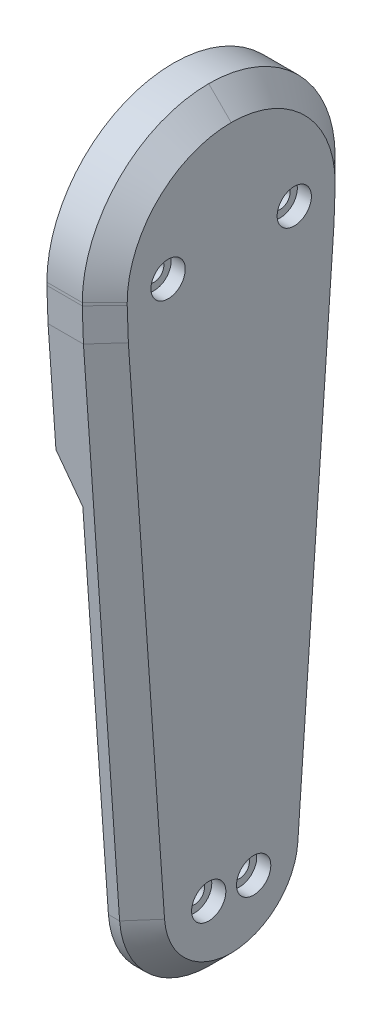
ISO-10303-21;
HEADER;
FILE_DESCRIPTION(('STEP AP214'),'2;1');
FILE_NAME('part.step','',(''),(''),'','','');
FILE_SCHEMA(('AUTOMOTIVE_DESIGN { 1 0 10303 214 1 1 1 1 }'));
ENDSEC;
DATA;
#1=APPLICATION_CONTEXT('core data for automotive mechanical design processes');
#2=APPLICATION_PROTOCOL_DEFINITION('international standard','automotive_design',2000,#1);
#3=PRODUCT_CONTEXT('',#1,'mechanical');
#4=PRODUCT('Part','Part','',(#3));
#5=PRODUCT_RELATED_PRODUCT_CATEGORY('part','',(#4));
#6=PRODUCT_DEFINITION_FORMATION('','',#4);
#7=PRODUCT_DEFINITION_CONTEXT('part definition',#1,'design');
#8=PRODUCT_DEFINITION('design','',#6,#7);
#9=PRODUCT_DEFINITION_SHAPE('','',#8);
#10=(LENGTH_UNIT() NAMED_UNIT(*) SI_UNIT(.MILLI.,.METRE.));
#11=(NAMED_UNIT(*) PLANE_ANGLE_UNIT() SI_UNIT($,.RADIAN.));
#12=(NAMED_UNIT(*) SI_UNIT($,.STERADIAN.) SOLID_ANGLE_UNIT());
#13=UNCERTAINTY_MEASURE_WITH_UNIT(LENGTH_MEASURE(1.E-05),#10,'distance_accuracy_value','');
#14=(GEOMETRIC_REPRESENTATION_CONTEXT(3) GLOBAL_UNCERTAINTY_ASSIGNED_CONTEXT((#13)) GLOBAL_UNIT_ASSIGNED_CONTEXT((#10,
#11,#12)) REPRESENTATION_CONTEXT('',''));
#15=CARTESIAN_POINT('',(0.,0.,0.));
#16=DIRECTION('',(0.,0.,1.));
#17=DIRECTION('',(1.,0.,0.));
#18=AXIS2_PLACEMENT_3D('',#15,#16,#17);
#19=CARTESIAN_POINT('',(28.3,-99.5,4.));
#20=DIRECTION('',(-1.,0.,0.));
#21=DIRECTION('',(0.,0.,1.));
#22=AXIS2_PLACEMENT_3D('',#19,#20,#21);
#23=CYLINDRICAL_SURFACE('',#22,1.75);
#24=CARTESIAN_POINT('',(22.3,-99.5,4.));
#25=DIRECTION('',(-1.,0.,0.));
#26=DIRECTION('',(0.,0.,1.));
#27=AXIS2_PLACEMENT_3D('',#24,#25,#26);
#28=CIRCLE('',#27,1.75);
#29=CARTESIAN_POINT('',(22.3,-99.5,5.75));
#30=VERTEX_POINT('',#29);
#31=EDGE_CURVE('E280',#30,#30,#28,.T.);
#32=ORIENTED_EDGE('',*,*,#31,.T.);
#33=EDGE_LOOP('',(#32));
#34=FACE_BOUND('',#33,.T.);
#35=CARTESIAN_POINT('',(25.8,-99.5,4.));
#36=DIRECTION('',(1.,0.,0.));
#37=DIRECTION('',(0.,0.,-1.));
#38=AXIS2_PLACEMENT_3D('',#35,#36,#37);
#39=CIRCLE('',#38,1.75);
#40=CARTESIAN_POINT('',(25.8,-99.5,2.25));
#41=VERTEX_POINT('',#40);
#42=EDGE_CURVE('E113',#41,#41,#39,.F.);
#43=ORIENTED_EDGE('',*,*,#42,.F.);
#44=EDGE_LOOP('',(#43));
#45=FACE_BOUND('',#44,.T.);
#46=ADVANCED_FACE('F108',(#34,#45),#23,.F.);
#47=CARTESIAN_POINT('',(28.3,-99.5,-4.));
#48=DIRECTION('',(-1.,0.,0.));
#49=DIRECTION('',(0.,0.,1.));
#50=AXIS2_PLACEMENT_3D('',#47,#48,#49);
#51=CYLINDRICAL_SURFACE('',#50,1.75);
#52=CARTESIAN_POINT('',(22.3,-99.5,-4.));
#53=DIRECTION('',(-1.,0.,0.));
#54=DIRECTION('',(0.,0.,1.));
#55=AXIS2_PLACEMENT_3D('',#52,#53,#54);
#56=CIRCLE('',#55,1.75);
#57=CARTESIAN_POINT('',(22.3,-99.5,-2.25));
#58=VERTEX_POINT('',#57);
#59=EDGE_CURVE('E281',#58,#58,#56,.T.);
#60=ORIENTED_EDGE('',*,*,#59,.T.);
#61=EDGE_LOOP('',(#60));
#62=FACE_BOUND('',#61,.T.);
#63=CARTESIAN_POINT('',(25.8,-99.5,-4.));
#64=DIRECTION('',(1.,0.,0.));
#65=DIRECTION('',(0.,0.,-1.));
#66=AXIS2_PLACEMENT_3D('',#63,#64,#65);
#67=CIRCLE('',#66,1.75);
#68=CARTESIAN_POINT('',(25.8,-99.5,-5.75));
#69=VERTEX_POINT('',#68);
#70=EDGE_CURVE('E600',#69,#69,#67,.F.);
#71=ORIENTED_EDGE('',*,*,#70,.F.);
#72=EDGE_LOOP('',(#71));
#73=FACE_BOUND('',#72,.T.);
#74=ADVANCED_FACE('F471',(#62,#73),#51,.F.);
#75=CARTESIAN_POINT('',(28.3,0.,11.225));
#76=DIRECTION('',(-1.,0.,0.));
#77=DIRECTION('',(0.,0.,1.));
#78=AXIS2_PLACEMENT_3D('',#75,#76,#77);
#79=CYLINDRICAL_SURFACE('',#78,1.75);
#80=CARTESIAN_POINT('',(18.,0.,11.225));
#81=DIRECTION('',(-1.,0.,0.));
#82=DIRECTION('',(0.,0.,1.));
#83=AXIS2_PLACEMENT_3D('',#80,#81,#82);
#84=CIRCLE('',#83,1.75);
#85=CARTESIAN_POINT('',(18.,0.,12.975));
#86=VERTEX_POINT('',#85);
#87=EDGE_CURVE('E242',#86,#86,#84,.T.);
#88=ORIENTED_EDGE('',*,*,#87,.T.);
#89=EDGE_LOOP('',(#88));
#90=FACE_BOUND('',#89,.T.);
#91=CARTESIAN_POINT('',(25.8,0.,11.225));
#92=DIRECTION('',(1.,0.,0.));
#93=DIRECTION('',(0.,0.,-1.));
#94=AXIS2_PLACEMENT_3D('',#91,#92,#93);
#95=CIRCLE('',#94,1.75);
#96=CARTESIAN_POINT('',(25.8,0.,9.475));
#97=VERTEX_POINT('',#96);
#98=EDGE_CURVE('E596',#97,#97,#95,.F.);
#99=ORIENTED_EDGE('',*,*,#98,.F.);
#100=EDGE_LOOP('',(#99));
#101=FACE_BOUND('',#100,.T.);
#102=ADVANCED_FACE('F478',(#90,#101),#79,.F.);
#103=CARTESIAN_POINT('',(28.3,0.,-11.225));
#104=DIRECTION('',(-1.,0.,0.));
#105=DIRECTION('',(0.,0.,1.));
#106=AXIS2_PLACEMENT_3D('',#103,#104,#105);
#107=CYLINDRICAL_SURFACE('',#106,1.75);
#108=CARTESIAN_POINT('',(18.,0.,-11.225));
#109=DIRECTION('',(-1.,0.,0.));
#110=DIRECTION('',(0.,0.,1.));
#111=AXIS2_PLACEMENT_3D('',#108,#109,#110);
#112=CIRCLE('',#111,1.75);
#113=CARTESIAN_POINT('',(18.,0.,-9.475));
#114=VERTEX_POINT('',#113);
#115=EDGE_CURVE('E607',#114,#114,#112,.T.);
#116=ORIENTED_EDGE('',*,*,#115,.T.);
#117=EDGE_LOOP('',(#116));
#118=FACE_BOUND('',#117,.T.);
#119=CARTESIAN_POINT('',(25.8,0.,-11.225));
#120=DIRECTION('',(1.,0.,0.));
#121=DIRECTION('',(0.,0.,-1.));
#122=AXIS2_PLACEMENT_3D('',#119,#120,#121);
#123=CIRCLE('',#122,1.75);
#124=CARTESIAN_POINT('',(25.8,0.,-12.975));
#125=VERTEX_POINT('',#124);
#126=EDGE_CURVE('E592',#125,#125,#123,.F.);
#127=ORIENTED_EDGE('',*,*,#126,.F.);
#128=EDGE_LOOP('',(#127));
#129=FACE_BOUND('',#128,.T.);
#130=ADVANCED_FACE('F501',(#118,#129),#107,.F.);
#131=CARTESIAN_POINT('',(28.3,35.,-22.5));
#132=DIRECTION('',(0.,0.,1.));
#133=DIRECTION('',(0.,-1.,0.));
#134=AXIS2_PLACEMENT_3D('',#131,#132,#133);
#135=PLANE('',#134);
#136=DIRECTION('',(-1.,0.,0.));
#137=VECTOR('',#136,1.);
#138=CARTESIAN_POINT('',(28.3,0.,-22.5));
#139=LINE('',#138,#137);
#140=CARTESIAN_POINT('',(18.,0.,-22.5));
#141=VERTEX_POINT('',#140);
#142=CARTESIAN_POINT('',(24.3,0.,-22.5));
#143=VERTEX_POINT('',#142);
#144=EDGE_CURVE('E294',#141,#143,#139,.F.);
#145=ORIENTED_EDGE('',*,*,#144,.T.);
#146=DIRECTION('',(0.,-1.,0.));
#147=VECTOR('',#146,1.);
#148=CARTESIAN_POINT('',(24.3,-0.499999999994338,-22.5));
#149=LINE('',#148,#147);
#150=CARTESIAN_POINT('',(24.3,-0.499999999994337,-22.5));
#151=VERTEX_POINT('',#150);
#152=EDGE_CURVE('E368',#143,#151,#149,.T.);
#153=ORIENTED_EDGE('',*,*,#152,.T.);
#154=DIRECTION('',(-1.,0.,0.));
#155=VECTOR('',#154,1.);
#156=CARTESIAN_POINT('',(20.,-0.499999999994337,-22.5));
#157=LINE('',#156,#155);
#158=CARTESIAN_POINT('',(18.,-0.499999999994338,-22.5));
#159=VERTEX_POINT('',#158);
#160=EDGE_CURVE('E253',#151,#159,#157,.T.);
#161=ORIENTED_EDGE('',*,*,#160,.T.);
#162=DIRECTION('',(0.,-1.,0.));
#163=VECTOR('',#162,1.);
#164=CARTESIAN_POINT('',(18.,0.,-22.5));
#165=LINE('',#164,#163);
#166=EDGE_CURVE('E269',#141,#159,#165,.T.);
#167=ORIENTED_EDGE('',*,*,#166,.F.);
#168=EDGE_LOOP('',(#145,#153,#161,#167));
#169=FACE_BOUND('',#168,.T.);
#170=ADVANCED_FACE('F497',(#169),#135,.F.);
#171=CARTESIAN_POINT('',(28.3,35.,22.5));
#172=DIRECTION('',(0.,0.,-1.));
#173=DIRECTION('',(0.,1.,0.));
#174=AXIS2_PLACEMENT_3D('',#171,#172,#173);
#175=PLANE('',#174);
#176=DIRECTION('',(1.,0.,0.));
#177=VECTOR('',#176,1.);
#178=CARTESIAN_POINT('',(28.3,-0.499999999994215,22.5));
#179=LINE('',#178,#177);
#180=CARTESIAN_POINT('',(18.,-0.499999999994213,22.5));
#181=VERTEX_POINT('',#180);
#182=CARTESIAN_POINT('',(24.3,-0.499999999994215,22.5));
#183=VERTEX_POINT('',#182);
#184=EDGE_CURVE('E254',#181,#183,#179,.T.);
#185=ORIENTED_EDGE('',*,*,#184,.T.);
#186=DIRECTION('',(0.,1.,0.));
#187=VECTOR('',#186,1.);
#188=CARTESIAN_POINT('',(24.3,0.,22.5));
#189=LINE('',#188,#187);
#190=CARTESIAN_POINT('',(24.3,0.,22.5));
#191=VERTEX_POINT('',#190);
#192=EDGE_CURVE('E377',#183,#191,#189,.T.);
#193=ORIENTED_EDGE('',*,*,#192,.T.);
#194=DIRECTION('',(1.,0.,0.));
#195=VECTOR('',#194,1.);
#196=CARTESIAN_POINT('',(20.,0.,22.5));
#197=LINE('',#196,#195);
#198=CARTESIAN_POINT('',(18.,0.,22.5));
#199=VERTEX_POINT('',#198);
#200=EDGE_CURVE('E298',#191,#199,#197,.F.);
#201=ORIENTED_EDGE('',*,*,#200,.T.);
#202=DIRECTION('',(0.,1.,0.));
#203=VECTOR('',#202,1.);
#204=CARTESIAN_POINT('',(18.,-0.499999999994213,22.5));
#205=LINE('',#204,#203);
#206=EDGE_CURVE('E259',#181,#199,#205,.T.);
#207=ORIENTED_EDGE('',*,*,#206,.F.);
#208=EDGE_LOOP('',(#185,#193,#201,#207));
#209=FACE_BOUND('',#208,.T.);
#210=ADVANCED_FACE('F493',(#209),#175,.F.);
#211=CARTESIAN_POINT('',(28.3,0.,0.));
#212=DIRECTION('',(1.,0.,0.));
#213=DIRECTION('',(0.,0.,-1.));
#214=AXIS2_PLACEMENT_3D('',#211,#212,#213);
#215=PLANE('',#214);
#216=CARTESIAN_POINT('',(28.3,0.,11.225));
#217=DIRECTION('',(1.,0.,0.));
#218=DIRECTION('',(0.,0.,-1.));
#219=AXIS2_PLACEMENT_3D('',#216,#217,#218);
#220=CIRCLE('',#219,3.05);
#221=CARTESIAN_POINT('',(28.3,0.,8.175));
#222=VERTEX_POINT('',#221);
#223=EDGE_CURVE('E635',#222,#222,#220,.T.);
#224=ORIENTED_EDGE('',*,*,#223,.F.);
#225=EDGE_LOOP('',(#224));
#226=FACE_BOUND('',#225,.T.);
#227=CARTESIAN_POINT('',(28.3,-99.5,-4.));
#228=DIRECTION('',(1.,0.,0.));
#229=DIRECTION('',(0.,0.,-1.));
#230=AXIS2_PLACEMENT_3D('',#227,#228,#229);
#231=CIRCLE('',#230,3.05);
#232=CARTESIAN_POINT('',(28.3,-99.5,-7.05));
#233=VERTEX_POINT('',#232);
#234=EDGE_CURVE('E623',#233,#233,#231,.T.);
#235=ORIENTED_EDGE('',*,*,#234,.F.);
#236=EDGE_LOOP('',(#235));
#237=FACE_BOUND('',#236,.T.);
#238=CARTESIAN_POINT('',(28.3,-99.5,4.));
#239=DIRECTION('',(1.,0.,0.));
#240=DIRECTION('',(0.,0.,-1.));
#241=AXIS2_PLACEMENT_3D('',#238,#239,#240);
#242=CIRCLE('',#241,3.05);
#243=CARTESIAN_POINT('',(28.3,-99.5,0.950000000000003));
#244=VERTEX_POINT('',#243);
#245=EDGE_CURVE('E622',#244,#244,#242,.T.);
#246=ORIENTED_EDGE('',*,*,#245,.F.);
#247=EDGE_LOOP('',(#246));
#248=FACE_BOUND('',#247,.T.);
#249=CARTESIAN_POINT('',(28.3,0.,-11.225));
#250=DIRECTION('',(1.,0.,0.));
#251=DIRECTION('',(0.,0.,-1.));
#252=AXIS2_PLACEMENT_3D('',#249,#250,#251);
#253=CIRCLE('',#252,3.05);
#254=CARTESIAN_POINT('',(28.3,0.,-14.275));
#255=VERTEX_POINT('',#254);
#256=EDGE_CURVE('E631',#255,#255,#253,.T.);
#257=ORIENTED_EDGE('',*,*,#256,.F.);
#258=EDGE_LOOP('',(#257));
#259=FACE_BOUND('',#258,.T.);
#260=DIRECTION('',(0.,0.997564050259825,-0.0697564737441219));
#261=VECTOR('',#260,1.);
#262=CARTESIAN_POINT('',(28.3,-1.3037023705264,-18.6438124989831));
#263=LINE('',#262,#261);
#264=CARTESIAN_POINT('',(28.3,-98.3370776849295,-11.8585779111291));
#265=VERTEX_POINT('',#264);
#266=CARTESIAN_POINT('',(28.3,-6.283316436867,-18.2956039626149));
#267=VERTEX_POINT('',#266);
#268=EDGE_CURVE('E330',#265,#267,#263,.T.);
#269=ORIENTED_EDGE('',*,*,#268,.T.);
#270=DIRECTION('',(0.,0.999390827019096,-0.0348994967024992));
#271=VECTOR('',#270,1.);
#272=CARTESIAN_POINT('',(28.3,-0.645771330246411,-18.4924713757825));
#273=LINE('',#272,#271);
#274=CARTESIAN_POINT('',(28.3,-0.430179740281577,-18.5));
#275=VERTEX_POINT('',#274);
#276=EDGE_CURVE('E360',#267,#275,#273,.T.);
#277=ORIENTED_EDGE('',*,*,#276,.T.);
#278=DIRECTION('',(0.,1.,0.));
#279=VECTOR('',#278,1.);
#280=CARTESIAN_POINT('',(28.3,0.,-18.5));
#281=LINE('',#280,#279);
#282=CARTESIAN_POINT('',(28.3,0.,-18.5));
#283=VERTEX_POINT('',#282);
#284=EDGE_CURVE('E357',#275,#283,#281,.T.);
#285=ORIENTED_EDGE('',*,*,#284,.T.);
#286=CARTESIAN_POINT('',(28.3,0.,0.));
#287=DIRECTION('',(1.,0.,0.));
#288=DIRECTION('',(0.,0.,-1.));
#289=AXIS2_PLACEMENT_3D('',#286,#287,#288);
#290=CIRCLE('',#289,18.5);
#291=CARTESIAN_POINT('',(28.3,18.5,0.));
#292=VERTEX_POINT('',#291);
#293=EDGE_CURVE('E354',#283,#292,#290,.T.);
#294=ORIENTED_EDGE('',*,*,#293,.T.);
#295=CARTESIAN_POINT('',(28.3,0.,0.));
#296=DIRECTION('',(1.,0.,0.));
#297=DIRECTION('',(0.,0.,-1.));
#298=AXIS2_PLACEMENT_3D('',#295,#296,#297);
#299=CIRCLE('',#298,18.5);
#300=CARTESIAN_POINT('',(28.3,0.,18.5));
#301=VERTEX_POINT('',#300);
#302=EDGE_CURVE('E351',#292,#301,#299,.T.);
#303=ORIENTED_EDGE('',*,*,#302,.T.);
#304=DIRECTION('',(0.,-1.,0.));
#305=VECTOR('',#304,1.);
#306=CARTESIAN_POINT('',(28.3,-0.499999999994213,18.5));
#307=LINE('',#306,#305);
#308=CARTESIAN_POINT('',(28.3,-0.430179740281471,18.5));
#309=VERTEX_POINT('',#308);
#310=EDGE_CURVE('E348',#301,#309,#307,.T.);
#311=ORIENTED_EDGE('',*,*,#310,.T.);
#312=DIRECTION('',(0.,-0.999390827019096,-0.0348994967024948));
#313=VECTOR('',#312,1.);
#314=CARTESIAN_POINT('',(28.3,-0.645771330246329,18.4924713757825));
#315=LINE('',#314,#313);
#316=CARTESIAN_POINT('',(28.3,-6.28331643686655,18.2956039626149));
#317=VERTEX_POINT('',#316);
#318=EDGE_CURVE('E345',#309,#317,#315,.T.);
#319=ORIENTED_EDGE('',*,*,#318,.T.);
#320=DIRECTION('',(0.,-0.997564050259825,-0.069756473744122));
#321=VECTOR('',#320,1.);
#322=CARTESIAN_POINT('',(28.3,-1.3037023705264,18.6438124989831));
#323=LINE('',#322,#321);
#324=CARTESIAN_POINT('',(28.3,-98.3370776849295,11.8585779111291));
#325=VERTEX_POINT('',#324);
#326=EDGE_CURVE('E342',#317,#325,#323,.T.);
#327=ORIENTED_EDGE('',*,*,#326,.T.);
#328=CARTESIAN_POINT('',(28.3,-97.5,-0.112190691988799));
#329=DIRECTION('',(1.,0.,0.));
#330=DIRECTION('',(0.,0.,-1.));
#331=AXIS2_PLACEMENT_3D('',#328,#329,#330);
#332=CIRCLE('',#331,12.);
#333=CARTESIAN_POINT('',(28.3,-109.499475540566,0.));
#334=VERTEX_POINT('',#333);
#335=EDGE_CURVE('E339',#325,#334,#332,.T.);
#336=ORIENTED_EDGE('',*,*,#335,.T.);
#337=CARTESIAN_POINT('',(28.3,-97.5,0.112190691988787));
#338=DIRECTION('',(1.,0.,0.));
#339=DIRECTION('',(0.,0.,-1.));
#340=AXIS2_PLACEMENT_3D('',#337,#338,#339);
#341=CIRCLE('',#340,12.);
#342=EDGE_CURVE('E336',#334,#265,#341,.T.);
#343=ORIENTED_EDGE('',*,*,#342,.T.);
#344=EDGE_LOOP('',(#269,#277,#285,#294,#303,#311,#319,#327,#336,#343));
#345=FACE_BOUND('',#344,.T.);
#346=ADVANCED_FACE('F490',(#226,#237,#248,#259,#345),#215,.T.);
#347=CARTESIAN_POINT('',(0.,0.,0.));
#348=DIRECTION('',(-1.,0.,0.));
#349=DIRECTION('',(0.,0.,1.));
#350=AXIS2_PLACEMENT_3D('',#347,#348,#349);
#351=CYLINDRICAL_SURFACE('',#350,22.5);
#352=ORIENTED_EDGE('',*,*,#200,.F.);
#353=CARTESIAN_POINT('',(24.3,0.,0.));
#354=DIRECTION('',(1.,0.,0.));
#355=DIRECTION('',(0.,0.,-1.));
#356=AXIS2_PLACEMENT_3D('',#353,#354,#355);
#357=CIRCLE('',#356,22.5);
#358=CARTESIAN_POINT('',(24.3,22.5,0.));
#359=VERTEX_POINT('',#358);
#360=EDGE_CURVE('E374',#191,#359,#357,.F.);
#361=ORIENTED_EDGE('',*,*,#360,.T.);
#362=DIRECTION('',(1.,0.,0.));
#363=VECTOR('',#362,1.);
#364=CARTESIAN_POINT('',(28.3,22.5,0.));
#365=LINE('',#364,#363);
#366=CARTESIAN_POINT('',(20.,22.5,0.));
#367=VERTEX_POINT('',#366);
#368=EDGE_CURVE('E292',#367,#359,#365,.T.);
#369=ORIENTED_EDGE('',*,*,#368,.F.);
#370=ORIENTED_EDGE('',*,*,#368,.T.);
#371=CARTESIAN_POINT('',(24.3,0.,0.));
#372=DIRECTION('',(1.,0.,0.));
#373=DIRECTION('',(0.,0.,-1.));
#374=AXIS2_PLACEMENT_3D('',#371,#372,#373);
#375=CIRCLE('',#374,22.5);
#376=EDGE_CURVE('E371',#359,#143,#375,.F.);
#377=ORIENTED_EDGE('',*,*,#376,.T.);
#378=ORIENTED_EDGE('',*,*,#144,.F.);
#379=CARTESIAN_POINT('',(18.,0.,0.));
#380=DIRECTION('',(-1.,0.,0.));
#381=DIRECTION('',(0.,0.,1.));
#382=AXIS2_PLACEMENT_3D('',#379,#380,#381);
#383=CIRCLE('',#382,22.5);
#384=EDGE_CURVE('E262',#199,#141,#383,.T.);
#385=ORIENTED_EDGE('',*,*,#384,.F.);
#386=EDGE_LOOP('',(#352,#361,#369,#370,#377,#378,#385));
#387=FACE_BOUND('',#386,.T.);
#388=ADVANCED_FACE('F488',(#387),#351,.T.);
#389=CARTESIAN_POINT('',(22.3,0.,0.));
#390=DIRECTION('',(1.,0.,0.));
#391=DIRECTION('',(0.,0.,-1.));
#392=AXIS2_PLACEMENT_3D('',#389,#390,#391);
#393=PLANE('',#392);
#394=ORIENTED_EDGE('',*,*,#59,.F.);
#395=EDGE_LOOP('',(#394));
#396=FACE_BOUND('',#395,.T.);
#397=ORIENTED_EDGE('',*,*,#31,.F.);
#398=EDGE_LOOP('',(#397));
#399=FACE_BOUND('',#398,.T.);
#400=DIRECTION('',(0.,-0.997564050259825,0.0697564737441219));
#401=VECTOR('',#400,1.);
#402=CARTESIAN_POINT('',(22.3,-113.5,-14.8080506862139));
#403=LINE('',#402,#401);
#404=CARTESIAN_POINT('',(22.3,-33.5,-20.4021956416944));
#405=VERTEX_POINT('',#404);
#406=CARTESIAN_POINT('',(22.3,-98.616103579906,-15.8488341121684));
#407=VERTEX_POINT('',#406);
#408=EDGE_CURVE('E305',#405,#407,#403,.T.);
#409=ORIENTED_EDGE('',*,*,#408,.T.);
#410=CARTESIAN_POINT('',(22.3,-97.5,0.112190691988787));
#411=DIRECTION('',(1.,0.,0.));
#412=DIRECTION('',(0.,0.,-1.));
#413=AXIS2_PLACEMENT_3D('',#410,#411,#412);
#414=CIRCLE('',#413,16.);
#415=CARTESIAN_POINT('',(22.3,-113.499606659185,0.));
#416=VERTEX_POINT('',#415);
#417=EDGE_CURVE('E323',#407,#416,#414,.F.);
#418=ORIENTED_EDGE('',*,*,#417,.T.);
#419=CARTESIAN_POINT('',(22.3,-97.5,-0.112190691988799));
#420=DIRECTION('',(1.,0.,0.));
#421=DIRECTION('',(0.,0.,-1.));
#422=AXIS2_PLACEMENT_3D('',#419,#420,#421);
#423=CIRCLE('',#422,16.);
#424=CARTESIAN_POINT('',(22.3,-98.616103579906,15.8488341121684));
#425=VERTEX_POINT('',#424);
#426=EDGE_CURVE('E320',#416,#425,#423,.F.);
#427=ORIENTED_EDGE('',*,*,#426,.T.);
#428=DIRECTION('',(0.,0.997564050259825,0.069756473744122));
#429=VECTOR('',#428,1.);
#430=CARTESIAN_POINT('',(22.3,-113.5,14.8080506862138));
#431=LINE('',#430,#429);
#432=CARTESIAN_POINT('',(22.3,-33.5,20.4021956416944));
#433=VERTEX_POINT('',#432);
#434=EDGE_CURVE('E301',#425,#433,#431,.T.);
#435=ORIENTED_EDGE('',*,*,#434,.T.);
#436=DIRECTION('',(0.,0.,-1.));
#437=VECTOR('',#436,1.);
#438=CARTESIAN_POINT('',(22.3,-33.5,-22.5));
#439=LINE('',#438,#437);
#440=EDGE_CURVE('E289',#433,#405,#439,.T.);
#441=ORIENTED_EDGE('',*,*,#440,.T.);
#442=EDGE_LOOP('',(#409,#418,#427,#435,#441));
#443=FACE_BOUND('',#442,.T.);
#444=ADVANCED_FACE('F484',(#396,#399,#443),#393,.F.);
#445=CARTESIAN_POINT('',(0.,-113.5,-14.8080506862139));
#446=DIRECTION('',(0.,-0.0697564737441219,-0.997564050259825));
#447=DIRECTION('',(-1.,0.,0.));
#448=AXIS2_PLACEMENT_3D('',#445,#446,#447);
#449=PLANE('',#448);
#450=ORIENTED_EDGE('',*,*,#408,.F.);
#451=DIRECTION('',(-0.528989945837286,0.846560875838962,-0.0591973031635217));
#452=VECTOR('',#451,1.);
#453=CARTESIAN_POINT('',(52.0607376667368,-81.1271360978114,-17.0717818523749));
#454=LINE('',#453,#452);
#455=CARTESIAN_POINT('',(18.,-26.6185615251235,-20.8833926958279));
#456=VERTEX_POINT('',#455);
#457=EDGE_CURVE('E12',#405,#456,#454,.T.);
#458=ORIENTED_EDGE('',*,*,#457,.T.);
#459=DIRECTION('',(0.,-0.997564050259825,0.0697564737441218));
#460=VECTOR('',#459,1.);
#461=CARTESIAN_POINT('',(18.,-6.49269215077417,-22.2907305787676));
#462=LINE('',#461,#460);
#463=CARTESIAN_POINT('',(18.,-6.49269215077417,-22.2907305787676));
#464=VERTEX_POINT('',#463);
#465=EDGE_CURVE('E277',#464,#456,#462,.T.);
#466=ORIENTED_EDGE('',*,*,#465,.F.);
#467=DIRECTION('',(1.,0.,0.));
#468=VECTOR('',#467,1.);
#469=CARTESIAN_POINT('',(28.3,-6.49269215077418,-22.2907305787676));
#470=LINE('',#469,#468);
#471=CARTESIAN_POINT('',(24.3,-6.49269215077418,-22.2907305787676));
#472=VERTEX_POINT('',#471);
#473=EDGE_CURVE('E313',#464,#472,#470,.T.);
#474=ORIENTED_EDGE('',*,*,#473,.T.);
#475=DIRECTION('',(0.,-0.997564050259825,0.0697564737441219));
#476=VECTOR('',#475,1.);
#477=CARTESIAN_POINT('',(24.3,-113.5,-14.8080506862139));
#478=LINE('',#477,#476);
#479=CARTESIAN_POINT('',(24.3,-98.616103579906,-15.8488341121684));
#480=VERTEX_POINT('',#479);
#481=EDGE_CURVE('E391',#472,#480,#478,.T.);
#482=ORIENTED_EDGE('',*,*,#481,.T.);
#483=DIRECTION('',(1.,0.,0.));
#484=VECTOR('',#483,1.);
#485=CARTESIAN_POINT('',(0.,-98.616103579906,-15.8488341121684));
#486=LINE('',#485,#484);
#487=EDGE_CURVE('E317',#480,#407,#486,.F.);
#488=ORIENTED_EDGE('',*,*,#487,.T.);
#489=EDGE_LOOP('',(#450,#458,#466,#474,#482,#488));
#490=FACE_BOUND('',#489,.T.);
#491=ADVANCED_FACE('F487',(#490),#449,.T.);
#492=CARTESIAN_POINT('',(0.,-113.5,14.8080506862138));
#493=DIRECTION('',(0.,-0.069756473744122,0.997564050259825));
#494=DIRECTION('',(1.,0.,0.));
#495=AXIS2_PLACEMENT_3D('',#492,#493,#494);
#496=PLANE('',#495);
#497=DIRECTION('',(0.,0.997564050259824,0.0697564737441226));
#498=VECTOR('',#497,1.);
#499=CARTESIAN_POINT('',(18.,-33.5,20.4021956416944));
#500=LINE('',#499,#498);
#501=CARTESIAN_POINT('',(18.,-26.6185615251235,20.8833926958279));
#502=VERTEX_POINT('',#501);
#503=CARTESIAN_POINT('',(18.,-6.49269215077375,22.2907305787677));
#504=VERTEX_POINT('',#503);
#505=EDGE_CURVE('E231',#502,#504,#500,.T.);
#506=ORIENTED_EDGE('',*,*,#505,.F.);
#507=DIRECTION('',(0.528989945837286,-0.846560875838962,-0.0591973031635218));
#508=VECTOR('',#507,1.);
#509=CARTESIAN_POINT('',(52.0607376667368,-81.1271360978114,17.0717818523749));
#510=LINE('',#509,#508);
#511=EDGE_CURVE('E119',#502,#433,#510,.T.);
#512=ORIENTED_EDGE('',*,*,#511,.T.);
#513=ORIENTED_EDGE('',*,*,#434,.F.);
#514=DIRECTION('',(-1.,0.,0.));
#515=VECTOR('',#514,1.);
#516=CARTESIAN_POINT('',(0.,-98.616103579906,15.8488341121684));
#517=LINE('',#516,#515);
#518=CARTESIAN_POINT('',(24.3,-98.616103579906,15.8488341121684));
#519=VERTEX_POINT('',#518);
#520=EDGE_CURVE('E327',#425,#519,#517,.F.);
#521=ORIENTED_EDGE('',*,*,#520,.T.);
#522=DIRECTION('',(0.,0.997564050259825,0.069756473744122));
#523=VECTOR('',#522,1.);
#524=CARTESIAN_POINT('',(24.3,-113.5,14.8080506862138));
#525=LINE('',#524,#523);
#526=CARTESIAN_POINT('',(24.3,-6.49269215077377,22.2907305787677));
#527=VERTEX_POINT('',#526);
#528=EDGE_CURVE('E249',#519,#527,#525,.T.);
#529=ORIENTED_EDGE('',*,*,#528,.T.);
#530=DIRECTION('',(-1.,0.,0.));
#531=VECTOR('',#530,1.);
#532=CARTESIAN_POINT('',(20.,-6.49269215077377,22.2907305787677));
#533=LINE('',#532,#531);
#534=EDGE_CURVE('E245',#527,#504,#533,.T.);
#535=ORIENTED_EDGE('',*,*,#534,.T.);
#536=EDGE_LOOP('',(#506,#512,#513,#521,#529,#535));
#537=FACE_BOUND('',#536,.T.);
#538=ADVANCED_FACE('F246',(#537),#496,.T.);
#539=CARTESIAN_POINT('',(28.3,-0.499999999994213,22.5));
#540=DIRECTION('',(0.,-0.0348994967024948,0.999390827019096));
#541=DIRECTION('',(-1.,0.,0.));
#542=AXIS2_PLACEMENT_3D('',#539,#540,#541);
#543=PLANE('',#542);
#544=ORIENTED_EDGE('',*,*,#534,.F.);
#545=DIRECTION('',(0.,0.999390827019096,0.0348994967024948));
#546=VECTOR('',#545,1.);
#547=CARTESIAN_POINT('',(24.3,-0.499999999994213,22.5));
#548=LINE('',#547,#546);
#549=EDGE_CURVE('E380',#527,#183,#548,.T.);
#550=ORIENTED_EDGE('',*,*,#549,.T.);
#551=ORIENTED_EDGE('',*,*,#184,.F.);
#552=DIRECTION('',(0.,0.999390827019096,0.034899496702495));
#553=VECTOR('',#552,1.);
#554=CARTESIAN_POINT('',(18.,-6.49269215077375,22.2907305787677));
#555=LINE('',#554,#553);
#556=EDGE_CURVE('E237',#504,#181,#555,.T.);
#557=ORIENTED_EDGE('',*,*,#556,.F.);
#558=EDGE_LOOP('',(#544,#550,#551,#557));
#559=FACE_BOUND('',#558,.T.);
#560=ADVANCED_FACE('F256',(#559),#543,.T.);
#561=CARTESIAN_POINT('',(28.3,-0.499999999994338,-22.5));
#562=DIRECTION('',(0.,-0.0348994967024992,-0.999390827019096));
#563=DIRECTION('',(1.,0.,0.));
#564=AXIS2_PLACEMENT_3D('',#561,#562,#563);
#565=PLANE('',#564);
#566=ORIENTED_EDGE('',*,*,#160,.F.);
#567=DIRECTION('',(0.,-0.999390827019096,0.0348994967024992));
#568=VECTOR('',#567,1.);
#569=CARTESIAN_POINT('',(24.3,-0.499999999994338,-22.5));
#570=LINE('',#569,#568);
#571=EDGE_CURVE('E364',#151,#472,#570,.T.);
#572=ORIENTED_EDGE('',*,*,#571,.T.);
#573=ORIENTED_EDGE('',*,*,#473,.F.);
#574=DIRECTION('',(0.,-0.999390827019096,0.0348994967024991));
#575=VECTOR('',#574,1.);
#576=CARTESIAN_POINT('',(18.,-0.499999999994338,-22.5));
#577=LINE('',#576,#575);
#578=EDGE_CURVE('E273',#159,#464,#577,.T.);
#579=ORIENTED_EDGE('',*,*,#578,.F.);
#580=EDGE_LOOP('',(#566,#572,#573,#579));
#581=FACE_BOUND('',#580,.T.);
#582=ADVANCED_FACE('F521',(#581),#565,.T.);
#583=CARTESIAN_POINT('',(0.,-97.5,-0.112190691988799));
#584=DIRECTION('',(-1.,0.,0.));
#585=DIRECTION('',(0.,0.,1.));
#586=AXIS2_PLACEMENT_3D('',#583,#584,#585);
#587=CYLINDRICAL_SURFACE('',#586,16.);
#588=DIRECTION('',(-1.,0.,0.));
#589=VECTOR('',#588,1.);
#590=CARTESIAN_POINT('',(25.3,-113.499606659185,0.));
#591=LINE('',#590,#589);
#592=CARTESIAN_POINT('',(24.3,-113.499606659185,0.));
#593=VERTEX_POINT('',#592);
#594=EDGE_CURVE('E293',#593,#416,#591,.T.);
#595=ORIENTED_EDGE('',*,*,#594,.F.);
#596=CARTESIAN_POINT('',(24.3,-97.5,-0.112190691988799));
#597=DIRECTION('',(1.,0.,0.));
#598=DIRECTION('',(0.,0.,-1.));
#599=AXIS2_PLACEMENT_3D('',#596,#597,#598);
#600=CIRCLE('',#599,16.);
#601=EDGE_CURVE('E385',#593,#519,#600,.F.);
#602=ORIENTED_EDGE('',*,*,#601,.T.);
#603=ORIENTED_EDGE('',*,*,#520,.F.);
#604=ORIENTED_EDGE('',*,*,#426,.F.);
#605=EDGE_LOOP('',(#595,#602,#603,#604));
#606=FACE_BOUND('',#605,.T.);
#607=ADVANCED_FACE('F466',(#606),#587,.T.);
#608=CARTESIAN_POINT('',(0.,-97.5,0.112190691988787));
#609=DIRECTION('',(1.,0.,0.));
#610=DIRECTION('',(0.,0.,-1.));
#611=AXIS2_PLACEMENT_3D('',#608,#609,#610);
#612=CYLINDRICAL_SURFACE('',#611,16.);
#613=ORIENTED_EDGE('',*,*,#487,.F.);
#614=CARTESIAN_POINT('',(24.3,-97.5,0.112190691988787));
#615=DIRECTION('',(1.,0.,0.));
#616=DIRECTION('',(0.,0.,-1.));
#617=AXIS2_PLACEMENT_3D('',#614,#615,#616);
#618=CIRCLE('',#617,16.);
#619=EDGE_CURVE('E388',#480,#593,#618,.F.);
#620=ORIENTED_EDGE('',*,*,#619,.T.);
#621=ORIENTED_EDGE('',*,*,#594,.T.);
#622=ORIENTED_EDGE('',*,*,#417,.F.);
#623=EDGE_LOOP('',(#613,#620,#621,#622));
#624=FACE_BOUND('',#623,.T.);
#625=ADVANCED_FACE('F461',(#624),#612,.T.);
#626=CARTESIAN_POINT('',(28.3,-0.645771330246329,18.4924713757825));
#627=DIRECTION('',(-0.707106781186548,0.0246776707783316,-0.706676030840834));
#628=DIRECTION('',(0.,-0.999390827019096,-0.0348994967024948));
#629=AXIS2_PLACEMENT_3D('',#626,#627,#628);
#630=PLANE('',#629);
#631=DIRECTION('',(0.707052927141246,0.0123416547509158,-0.707052927141247));
#632=VECTOR('',#631,1.);
#633=CARTESIAN_POINT('',(28.3018824427377,-0.430146882121255,18.4981175572623));
#634=LINE('',#633,#632);
#635=EDGE_CURVE('E573',#183,#309,#634,.T.);
#636=ORIENTED_EDGE('',*,*,#635,.F.);
#637=ORIENTED_EDGE('',*,*,#549,.F.);
#638=DIRECTION('',(-0.707052927141246,-0.0370099278475946,0.706191492062679));
#639=VECTOR('',#638,1.);
#640=CARTESIAN_POINT('',(28.2564407681112,-6.28559649818503,18.3391101242894));
#641=LINE('',#640,#639);
#642=EDGE_CURVE('E333',#317,#527,#641,.T.);
#643=ORIENTED_EDGE('',*,*,#642,.F.);
#644=ORIENTED_EDGE('',*,*,#318,.F.);
#645=EDGE_LOOP('',(#636,#637,#643,#644));
#646=FACE_BOUND('',#645,.T.);
#647=ADVANCED_FACE('F455',(#646),#630,.F.);
#648=CARTESIAN_POINT('',(28.3,-1.3037023705264,18.6438124989831));
#649=DIRECTION('',(-0.707106781186548,0.04932527561613,-0.705384304606639));
#650=DIRECTION('',(0.,-0.997564050259825,-0.069756473744122));
#651=AXIS2_PLACEMENT_3D('',#648,#649,#650);
#652=PLANE('',#651);
#653=ORIENTED_EDGE('',*,*,#642,.T.);
#654=ORIENTED_EDGE('',*,*,#528,.F.);
#655=DIRECTION('',(-0.707106781186547,-0.0493252756161292,0.70538430460664));
#656=VECTOR('',#655,1.);
#657=CARTESIAN_POINT('',(28.3,-98.3370776849295,11.8585779111291));
#658=LINE('',#657,#656);
#659=EDGE_CURVE('E575',#325,#519,#658,.T.);
#660=ORIENTED_EDGE('',*,*,#659,.F.);
#661=ORIENTED_EDGE('',*,*,#326,.F.);
#662=EDGE_LOOP('',(#653,#654,#660,#661));
#663=FACE_BOUND('',#662,.T.);
#664=ADVANCED_FACE('F449',(#663),#652,.F.);
#665=CARTESIAN_POINT('',(28.3,0.,18.5));
#666=DIRECTION('',(0.707106781186548,0.,0.707106781186547));
#667=DIRECTION('',(0.,1.,0.));
#668=AXIS2_PLACEMENT_3D('',#665,#666,#667);
#669=PLANE('',#668);
#670=ORIENTED_EDGE('',*,*,#635,.T.);
#671=ORIENTED_EDGE('',*,*,#310,.F.);
#672=DIRECTION('',(0.707106781186547,0.,-0.707106781186548));
#673=VECTOR('',#672,1.);
#674=CARTESIAN_POINT('',(24.3,0.,22.5));
#675=LINE('',#674,#673);
#676=EDGE_CURVE('E421',#191,#301,#675,.T.);
#677=ORIENTED_EDGE('',*,*,#676,.F.);
#678=ORIENTED_EDGE('',*,*,#192,.F.);
#679=EDGE_LOOP('',(#670,#671,#677,#678));
#680=FACE_BOUND('',#679,.T.);
#681=ADVANCED_FACE('F436',(#680),#669,.T.);
#682=CARTESIAN_POINT('',(28.3,-97.5,-0.112190691988799));
#683=DIRECTION('',(-1.,0.,0.));
#684=DIRECTION('',(0.,0.,1.));
#685=AXIS2_PLACEMENT_3D('',#682,#683,#684);
#686=CONICAL_SURFACE('',#685,12.,0.785398163397449);
#687=ORIENTED_EDGE('',*,*,#659,.T.);
#688=ORIENTED_EDGE('',*,*,#601,.F.);
#689=CARTESIAN_POINT('',(28.3,-109.499475540566,0.));
#690=CARTESIAN_POINT('',(27.6333364553582,-110.166167182259,0.));
#691=CARTESIAN_POINT('',(26.9666713497037,-110.832857262991,0.));
#692=CARTESIAN_POINT('',(25.6333380163704,-112.166234302531,0.));
#693=CARTESIAN_POINT('',(24.9666697886915,-112.832921261339,0.));
#694=CARTESIAN_POINT('',(24.3,-113.499606659185,0.));
#695=B_SPLINE_CURVE_WITH_KNOTS('',3,(#689,#690,#691,#692,#693,#694),.UNSPECIFIED.,.F.,.F.,(4,2,
4),(0.,2.82847348256847,5.6569469651325),.UNSPECIFIED.);
#696=EDGE_CURVE('E411',#334,#593,#695,.T.);
#697=ORIENTED_EDGE('',*,*,#696,.F.);
#698=ORIENTED_EDGE('',*,*,#335,.F.);
#699=EDGE_LOOP('',(#687,#688,#697,#698));
#700=FACE_BOUND('',#699,.T.);
#701=ADVANCED_FACE('F428',(#700),#686,.T.);
#702=CARTESIAN_POINT('',(28.3,0.,0.));
#703=DIRECTION('',(-1.,0.,0.));
#704=DIRECTION('',(0.,0.,1.));
#705=AXIS2_PLACEMENT_3D('',#702,#703,#704);
#706=CONICAL_SURFACE('',#705,18.5,0.785398163397449);
#707=ORIENTED_EDGE('',*,*,#676,.T.);
#708=ORIENTED_EDGE('',*,*,#302,.F.);
#709=DIRECTION('',(0.707106781186547,-0.707106781186548,0.));
#710=VECTOR('',#709,1.);
#711=CARTESIAN_POINT('',(24.3,22.5,0.));
#712=LINE('',#711,#710);
#713=EDGE_CURVE('E407',#359,#292,#712,.T.);
#714=ORIENTED_EDGE('',*,*,#713,.F.);
#715=ORIENTED_EDGE('',*,*,#360,.F.);
#716=EDGE_LOOP('',(#707,#708,#714,#715));
#717=FACE_BOUND('',#716,.T.);
#718=ADVANCED_FACE('F435',(#717),#706,.T.);
#719=CARTESIAN_POINT('',(28.3,-97.5,0.112190691988787));
#720=DIRECTION('',(-1.,0.,0.));
#721=DIRECTION('',(0.,0.,1.));
#722=AXIS2_PLACEMENT_3D('',#719,#720,#721);
#723=CONICAL_SURFACE('',#722,12.,0.785398163397449);
#724=ORIENTED_EDGE('',*,*,#696,.T.);
#725=ORIENTED_EDGE('',*,*,#619,.F.);
#726=DIRECTION('',(-0.707106781186547,-0.0493252756161292,-0.70538430460664));
#727=VECTOR('',#726,1.);
#728=CARTESIAN_POINT('',(28.3,-98.3370776849295,-11.8585779111291));
#729=LINE('',#728,#727);
#730=EDGE_CURVE('E403',#265,#480,#729,.T.);
#731=ORIENTED_EDGE('',*,*,#730,.F.);
#732=ORIENTED_EDGE('',*,*,#342,.F.);
#733=EDGE_LOOP('',(#724,#725,#731,#732));
#734=FACE_BOUND('',#733,.T.);
#735=ADVANCED_FACE('F424',(#734),#723,.T.);
#736=CARTESIAN_POINT('',(28.3,0.,0.));
#737=DIRECTION('',(-1.,0.,0.));
#738=DIRECTION('',(0.,0.,1.));
#739=AXIS2_PLACEMENT_3D('',#736,#737,#738);
#740=CONICAL_SURFACE('',#739,18.5,0.785398163397449);
#741=ORIENTED_EDGE('',*,*,#713,.T.);
#742=ORIENTED_EDGE('',*,*,#293,.F.);
#743=DIRECTION('',(0.707106781186547,0.,0.707106781186548));
#744=VECTOR('',#743,1.);
#745=CARTESIAN_POINT('',(24.3,0.,-22.5));
#746=LINE('',#745,#744);
#747=EDGE_CURVE('E399',#143,#283,#746,.T.);
#748=ORIENTED_EDGE('',*,*,#747,.F.);
#749=ORIENTED_EDGE('',*,*,#376,.F.);
#750=EDGE_LOOP('',(#741,#742,#748,#749));
#751=FACE_BOUND('',#750,.T.);
#752=ADVANCED_FACE('F550',(#751),#740,.T.);
#753=CARTESIAN_POINT('',(28.3,-1.3037023705264,-18.6438124989831));
#754=DIRECTION('',(-0.707106781186548,0.0493252756161299,0.705384304606639));
#755=DIRECTION('',(0.,0.997564050259825,-0.0697564737441219));
#756=AXIS2_PLACEMENT_3D('',#753,#754,#755);
#757=PLANE('',#756);
#758=ORIENTED_EDGE('',*,*,#730,.T.);
#759=ORIENTED_EDGE('',*,*,#481,.F.);
#760=DIRECTION('',(0.707052927141246,0.0370099278475882,0.706191492062679));
#761=VECTOR('',#760,1.);
#762=CARTESIAN_POINT('',(28.2564407681112,-6.28559649818547,-18.3391101242894));
#763=LINE('',#762,#761);
#764=EDGE_CURVE('E396',#267,#472,#763,.F.);
#765=ORIENTED_EDGE('',*,*,#764,.F.);
#766=ORIENTED_EDGE('',*,*,#268,.F.);
#767=EDGE_LOOP('',(#758,#759,#765,#766));
#768=FACE_BOUND('',#767,.T.);
#769=ADVANCED_FACE('F544',(#768),#757,.F.);
#770=CARTESIAN_POINT('',(28.3,0.,-18.5));
#771=DIRECTION('',(0.707106781186548,0.,-0.707106781186547));
#772=DIRECTION('',(0.,-1.,0.));
#773=AXIS2_PLACEMENT_3D('',#770,#771,#772);
#774=PLANE('',#773);
#775=ORIENTED_EDGE('',*,*,#747,.T.);
#776=ORIENTED_EDGE('',*,*,#284,.F.);
#777=DIRECTION('',(0.707052927141246,0.0123416547509209,0.707052927141247));
#778=VECTOR('',#777,1.);
#779=CARTESIAN_POINT('',(28.3037538357907,-0.430114216834115,-18.4962461642093));
#780=LINE('',#779,#778);
#781=EDGE_CURVE('E285',#151,#275,#780,.T.);
#782=ORIENTED_EDGE('',*,*,#781,.F.);
#783=ORIENTED_EDGE('',*,*,#152,.F.);
#784=EDGE_LOOP('',(#775,#776,#782,#783));
#785=FACE_BOUND('',#784,.T.);
#786=ADVANCED_FACE('F537',(#785),#774,.T.);
#787=CARTESIAN_POINT('',(28.3,-0.64577133024641,-18.4924713757825));
#788=DIRECTION('',(-0.707106781186548,0.0246776707783347,0.706676030840834));
#789=DIRECTION('',(0.,0.999390827019096,-0.0348994967024992));
#790=AXIS2_PLACEMENT_3D('',#787,#788,#789);
#791=PLANE('',#790);
#792=ORIENTED_EDGE('',*,*,#764,.T.);
#793=ORIENTED_EDGE('',*,*,#571,.F.);
#794=ORIENTED_EDGE('',*,*,#781,.T.);
#795=ORIENTED_EDGE('',*,*,#276,.F.);
#796=EDGE_LOOP('',(#792,#793,#794,#795));
#797=FACE_BOUND('',#796,.T.);
#798=ADVANCED_FACE('F531',(#797),#791,.F.);
#799=CARTESIAN_POINT('',(18.,0.,0.));
#800=DIRECTION('',(-1.,0.,0.));
#801=DIRECTION('',(0.,0.,1.));
#802=AXIS2_PLACEMENT_3D('',#799,#800,#801);
#803=PLANE('',#802);
#804=ORIENTED_EDGE('',*,*,#87,.F.);
#805=EDGE_LOOP('',(#804));
#806=FACE_BOUND('',#805,.T.);
#807=ORIENTED_EDGE('',*,*,#465,.T.);
#808=DIRECTION('',(0.,0.,1.));
#809=VECTOR('',#808,1.);
#810=CARTESIAN_POINT('',(18.,-26.6185615251235,20.4021956416944));
#811=LINE('',#810,#809);
#812=EDGE_CURVE('E239',#456,#502,#811,.T.);
#813=ORIENTED_EDGE('',*,*,#812,.T.);
#814=ORIENTED_EDGE('',*,*,#505,.T.);
#815=ORIENTED_EDGE('',*,*,#556,.T.);
#816=ORIENTED_EDGE('',*,*,#206,.T.);
#817=ORIENTED_EDGE('',*,*,#384,.T.);
#818=ORIENTED_EDGE('',*,*,#166,.T.);
#819=ORIENTED_EDGE('',*,*,#578,.T.);
#820=EDGE_LOOP('',(#807,#813,#814,#815,#816,#817,#818,#819));
#821=FACE_BOUND('',#820,.T.);
#822=ORIENTED_EDGE('',*,*,#115,.F.);
#823=EDGE_LOOP('',(#822));
#824=FACE_BOUND('',#823,.T.);
#825=ADVANCED_FACE('F233',(#806,#821,#824),#803,.T.);
#826=CARTESIAN_POINT('',(18.,-26.6185615251235,0.));
#827=DIRECTION('',(-0.848048096156425,-0.529919264233206,0.));
#828=DIRECTION('',(0.,0.,-1.));
#829=AXIS2_PLACEMENT_3D('',#826,#827,#828);
#830=PLANE('',#829);
#831=ORIENTED_EDGE('',*,*,#457,.F.);
#832=ORIENTED_EDGE('',*,*,#440,.F.);
#833=ORIENTED_EDGE('',*,*,#511,.F.);
#834=ORIENTED_EDGE('',*,*,#812,.F.);
#835=EDGE_LOOP('',(#831,#832,#833,#834));
#836=FACE_BOUND('',#835,.T.);
#837=ADVANCED_FACE('F111',(#836),#830,.T.);
#838=CARTESIAN_POINT('',(25.8,0.,-11.225));
#839=DIRECTION('',(1.,0.,0.));
#840=DIRECTION('',(0.,0.,-1.));
#841=AXIS2_PLACEMENT_3D('',#838,#839,#840);
#842=PLANE('',#841);
#843=CARTESIAN_POINT('',(25.8,0.,-11.225));
#844=DIRECTION('',(1.,0.,0.));
#845=DIRECTION('',(0.,0.,-1.));
#846=AXIS2_PLACEMENT_3D('',#843,#844,#845);
#847=CIRCLE('',#846,3.05);
#848=CARTESIAN_POINT('',(25.8,0.,-14.275));
#849=VERTEX_POINT('',#848);
#850=EDGE_CURVE('E627',#849,#849,#847,.T.);
#851=ORIENTED_EDGE('',*,*,#850,.T.);
#852=EDGE_LOOP('',(#851));
#853=FACE_BOUND('',#852,.T.);
#854=ORIENTED_EDGE('',*,*,#126,.T.);
#855=EDGE_LOOP('',(#854));
#856=FACE_BOUND('',#855,.T.);
#857=ADVANCED_FACE('F668',(#853,#856),#842,.T.);
#858=CARTESIAN_POINT('',(25.8,0.,-11.225));
#859=DIRECTION('',(1.,0.,0.));
#860=DIRECTION('',(0.,0.,-1.));
#861=AXIS2_PLACEMENT_3D('',#858,#859,#860);
#862=CYLINDRICAL_SURFACE('',#861,3.05);
#863=ORIENTED_EDGE('',*,*,#850,.F.);
#864=EDGE_LOOP('',(#863));
#865=FACE_BOUND('',#864,.T.);
#866=ORIENTED_EDGE('',*,*,#256,.T.);
#867=EDGE_LOOP('',(#866));
#868=FACE_BOUND('',#867,.T.);
#869=ADVANCED_FACE('F666',(#865,#868),#862,.F.);
#870=CARTESIAN_POINT('',(25.8,0.,11.225));
#871=DIRECTION('',(1.,0.,0.));
#872=DIRECTION('',(0.,0.,-1.));
#873=AXIS2_PLACEMENT_3D('',#870,#871,#872);
#874=PLANE('',#873);
#875=CARTESIAN_POINT('',(25.8,0.,11.225));
#876=DIRECTION('',(1.,0.,0.));
#877=DIRECTION('',(0.,0.,-1.));
#878=AXIS2_PLACEMENT_3D('',#875,#876,#877);
#879=CIRCLE('',#878,3.05);
#880=CARTESIAN_POINT('',(25.8,0.,8.175));
#881=VERTEX_POINT('',#880);
#882=EDGE_CURVE('E597',#881,#881,#879,.T.);
#883=ORIENTED_EDGE('',*,*,#882,.T.);
#884=EDGE_LOOP('',(#883));
#885=FACE_BOUND('',#884,.T.);
#886=ORIENTED_EDGE('',*,*,#98,.T.);
#887=EDGE_LOOP('',(#886));
#888=FACE_BOUND('',#887,.T.);
#889=ADVANCED_FACE('F650',(#885,#888),#874,.T.);
#890=CARTESIAN_POINT('',(25.8,0.,11.225));
#891=DIRECTION('',(1.,0.,0.));
#892=DIRECTION('',(0.,0.,-1.));
#893=AXIS2_PLACEMENT_3D('',#890,#891,#892);
#894=CYLINDRICAL_SURFACE('',#893,3.05);
#895=ORIENTED_EDGE('',*,*,#882,.F.);
#896=EDGE_LOOP('',(#895));
#897=FACE_BOUND('',#896,.T.);
#898=ORIENTED_EDGE('',*,*,#223,.T.);
#899=EDGE_LOOP('',(#898));
#900=FACE_BOUND('',#899,.T.);
#901=ADVANCED_FACE('F653',(#897,#900),#894,.F.);
#902=CARTESIAN_POINT('',(25.8,-99.5,-4.));
#903=DIRECTION('',(1.,0.,0.));
#904=DIRECTION('',(0.,0.,-1.));
#905=AXIS2_PLACEMENT_3D('',#902,#903,#904);
#906=PLANE('',#905);
#907=CARTESIAN_POINT('',(25.8,-99.5,-4.));
#908=DIRECTION('',(1.,0.,0.));
#909=DIRECTION('',(0.,0.,-1.));
#910=AXIS2_PLACEMENT_3D('',#907,#908,#909);
#911=CIRCLE('',#910,3.05);
#912=CARTESIAN_POINT('',(25.8,-99.5,-7.05));
#913=VERTEX_POINT('',#912);
#914=EDGE_CURVE('E636',#913,#913,#911,.T.);
#915=ORIENTED_EDGE('',*,*,#914,.T.);
#916=EDGE_LOOP('',(#915));
#917=FACE_BOUND('',#916,.T.);
#918=ORIENTED_EDGE('',*,*,#70,.T.);
#919=EDGE_LOOP('',(#918));
#920=FACE_BOUND('',#919,.T.);
#921=ADVANCED_FACE('F656',(#917,#920),#906,.T.);
#922=CARTESIAN_POINT('',(25.8,-99.5,-4.));
#923=DIRECTION('',(1.,0.,0.));
#924=DIRECTION('',(0.,0.,-1.));
#925=AXIS2_PLACEMENT_3D('',#922,#923,#924);
#926=CYLINDRICAL_SURFACE('',#925,3.05);
#927=ORIENTED_EDGE('',*,*,#914,.F.);
#928=EDGE_LOOP('',(#927));
#929=FACE_BOUND('',#928,.T.);
#930=ORIENTED_EDGE('',*,*,#234,.T.);
#931=EDGE_LOOP('',(#930));
#932=FACE_BOUND('',#931,.T.);
#933=ADVANCED_FACE('F689',(#929,#932),#926,.F.);
#934=CARTESIAN_POINT('',(25.8,-99.5,4.));
#935=DIRECTION('',(1.,0.,0.));
#936=DIRECTION('',(0.,0.,-1.));
#937=AXIS2_PLACEMENT_3D('',#934,#935,#936);
#938=PLANE('',#937);
#939=CARTESIAN_POINT('',(25.8,-99.5,4.));
#940=DIRECTION('',(1.,0.,0.));
#941=DIRECTION('',(0.,0.,-1.));
#942=AXIS2_PLACEMENT_3D('',#939,#940,#941);
#943=CIRCLE('',#942,3.05);
#944=CARTESIAN_POINT('',(25.8,-99.5,0.950000000000003));
#945=VERTEX_POINT('',#944);
#946=EDGE_CURVE('E618',#945,#945,#943,.T.);
#947=ORIENTED_EDGE('',*,*,#946,.T.);
#948=EDGE_LOOP('',(#947));
#949=FACE_BOUND('',#948,.T.);
#950=ORIENTED_EDGE('',*,*,#42,.T.);
#951=EDGE_LOOP('',(#950));
#952=FACE_BOUND('',#951,.T.);
#953=ADVANCED_FACE('F685',(#949,#952),#938,.T.);
#954=CARTESIAN_POINT('',(25.8,-99.5,4.));
#955=DIRECTION('',(1.,0.,0.));
#956=DIRECTION('',(0.,0.,-1.));
#957=AXIS2_PLACEMENT_3D('',#954,#955,#956);
#958=CYLINDRICAL_SURFACE('',#957,3.05);
#959=ORIENTED_EDGE('',*,*,#946,.F.);
#960=EDGE_LOOP('',(#959));
#961=FACE_BOUND('',#960,.T.);
#962=ORIENTED_EDGE('',*,*,#245,.T.);
#963=EDGE_LOOP('',(#962));
#964=FACE_BOUND('',#963,.T.);
#965=ADVANCED_FACE('F682',(#961,#964),#958,.F.);
#966=CLOSED_SHELL('',(#46,#74,#102,#130,#170,#210,#346,#388,#444,#491,#538,#560,#582,#607,#625,
#647,#664,#681,#701,#718,#735,#752,#769,#786,#798,#825,#837,#857,#869,#889,#901,#921,#933,#953,#965));
#967=MANIFOLD_SOLID_BREP('B2',#966);
#968=ADVANCED_BREP_SHAPE_REPRESENTATION('',(#18,#967),#14);
#969=SHAPE_DEFINITION_REPRESENTATION(#9,#968);
ENDSEC;
END-ISO-10303-21;
